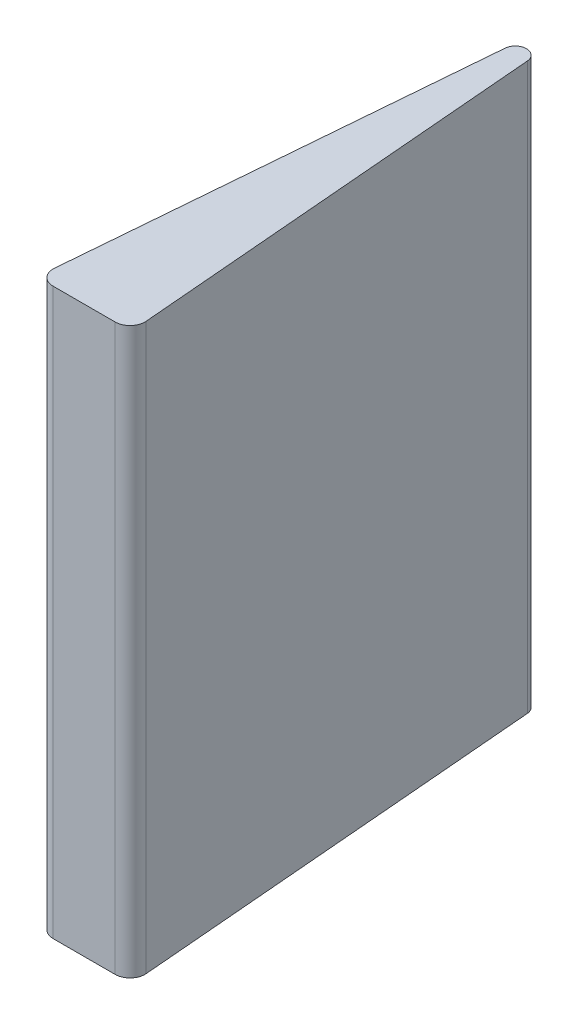
ISO-10303-21;
HEADER;
FILE_DESCRIPTION(('STEP AP214'),'2;1');
FILE_NAME('part.step','',(''),(''),'','','');
FILE_SCHEMA(('AUTOMOTIVE_DESIGN { 1 0 10303 214 1 1 1 1 }'));
ENDSEC;
DATA;
#1=APPLICATION_CONTEXT('core data for automotive mechanical design processes');
#2=APPLICATION_PROTOCOL_DEFINITION('international standard','automotive_design',2000,#1);
#3=PRODUCT_CONTEXT('',#1,'mechanical');
#4=PRODUCT('Part','Part','',(#3));
#5=PRODUCT_RELATED_PRODUCT_CATEGORY('part','',(#4));
#6=PRODUCT_DEFINITION_FORMATION('','',#4);
#7=PRODUCT_DEFINITION_CONTEXT('part definition',#1,'design');
#8=PRODUCT_DEFINITION('design','',#6,#7);
#9=PRODUCT_DEFINITION_SHAPE('','',#8);
#10=(LENGTH_UNIT() NAMED_UNIT(*) SI_UNIT(.MILLI.,.METRE.));
#11=(NAMED_UNIT(*) PLANE_ANGLE_UNIT() SI_UNIT($,.RADIAN.));
#12=(NAMED_UNIT(*) SI_UNIT($,.STERADIAN.) SOLID_ANGLE_UNIT());
#13=UNCERTAINTY_MEASURE_WITH_UNIT(LENGTH_MEASURE(1.E-05),#10,'distance_accuracy_value','');
#14=(GEOMETRIC_REPRESENTATION_CONTEXT(3) GLOBAL_UNCERTAINTY_ASSIGNED_CONTEXT((#13)) GLOBAL_UNIT_ASSIGNED_CONTEXT((#10,
#11,#12)) REPRESENTATION_CONTEXT('',''));
#15=CARTESIAN_POINT('',(0.,0.,0.));
#16=DIRECTION('',(0.,0.,1.));
#17=DIRECTION('',(1.,0.,0.));
#18=AXIS2_PLACEMENT_3D('',#15,#16,#17);
#19=CARTESIAN_POINT('',(0.,-380.,-460.));
#20=DIRECTION('',(0.,1.,0.));
#21=DIRECTION('',(0.,0.,1.));
#22=AXIS2_PLACEMENT_3D('',#19,#20,#21);
#23=CYLINDRICAL_SURFACE('',#22,15.);
#24=DIRECTION('',(0.,1.,0.));
#25=VECTOR('',#24,1.);
#26=CARTESIAN_POINT('',(-14.9478930237818,-380.,-461.249197402165));
#27=LINE('',#26,#25);
#28=CARTESIAN_POINT('',(-14.9478930237818,-380.,-461.249197402165));
#29=VERTEX_POINT('',#28);
#30=CARTESIAN_POINT('',(-14.9478930237818,380.,-461.249197402165));
#31=VERTEX_POINT('',#30);
#32=EDGE_CURVE('E47',#29,#31,#27,.T.);
#33=ORIENTED_EDGE('',*,*,#32,.T.);
#34=CARTESIAN_POINT('',(0.,380.,-460.));
#35=DIRECTION('',(0.,1.,0.));
#36=DIRECTION('',(0.,0.,-1.));
#37=AXIS2_PLACEMENT_3D('',#34,#35,#36);
#38=CIRCLE('',#37,15.);
#39=CARTESIAN_POINT('',(14.9478930237818,380.,-461.249197402165));
#40=VERTEX_POINT('',#39);
#41=EDGE_CURVE('E96',#40,#31,#38,.T.);
#42=ORIENTED_EDGE('',*,*,#41,.F.);
#43=DIRECTION('',(0.,1.,0.));
#44=VECTOR('',#43,1.);
#45=CARTESIAN_POINT('',(14.9478930237818,-380.,-461.249197402165));
#46=LINE('',#45,#44);
#47=CARTESIAN_POINT('',(14.9478930237818,-380.,-461.249197402165));
#48=VERTEX_POINT('',#47);
#49=EDGE_CURVE('E13',#48,#40,#46,.T.);
#50=ORIENTED_EDGE('',*,*,#49,.F.);
#51=CARTESIAN_POINT('',(0.,-380.,-460.));
#52=DIRECTION('',(0.,1.,0.));
#53=DIRECTION('',(0.,0.,-1.));
#54=AXIS2_PLACEMENT_3D('',#51,#52,#53);
#55=CIRCLE('',#54,15.);
#56=EDGE_CURVE('E97',#48,#29,#55,.T.);
#57=ORIENTED_EDGE('',*,*,#56,.T.);
#58=EDGE_LOOP('',(#33,#42,#50,#57));
#59=FACE_BOUND('',#58,.T.);
#60=ADVANCED_FACE('F44',(#59),#23,.T.);
#61=CARTESIAN_POINT('',(61.7123687517953,-380.,98.3344034637807));
#62=DIRECTION('',(0.996526201585455,0.,-0.0832798268109657));
#63=DIRECTION('',(-0.0832798268109657,0.,-0.996526201585455));
#64=AXIS2_PLACEMENT_3D('',#61,#62,#63);
#65=PLANE('',#64);
#66=ORIENTED_EDGE('',*,*,#49,.T.);
#67=DIRECTION('',(-0.0832798268109657,0.,-0.996526201585455));
#68=VECTOR('',#67,1.);
#69=CARTESIAN_POINT('',(61.7123687517953,380.,98.3344034637807));
#70=LINE('',#69,#68);
#71=CARTESIAN_POINT('',(61.7123687517953,380.,98.3344034637807));
#72=VERTEX_POINT('',#71);
#73=EDGE_CURVE('E114',#72,#40,#70,.T.);
#74=ORIENTED_EDGE('',*,*,#73,.F.);
#75=DIRECTION('',(0.,1.,0.));
#76=VECTOR('',#75,1.);
#77=CARTESIAN_POINT('',(61.7123687517953,-380.,98.3344034637807));
#78=LINE('',#77,#76);
#79=CARTESIAN_POINT('',(61.7123687517953,-380.,98.3344034637807));
#80=VERTEX_POINT('',#79);
#81=EDGE_CURVE('E52',#80,#72,#78,.T.);
#82=ORIENTED_EDGE('',*,*,#81,.F.);
#83=DIRECTION('',(-0.0832798268109657,0.,-0.996526201585455));
#84=VECTOR('',#83,1.);
#85=CARTESIAN_POINT('',(61.7123687517953,-380.,98.3344034637807));
#86=LINE('',#85,#84);
#87=EDGE_CURVE('E102',#80,#48,#86,.T.);
#88=ORIENTED_EDGE('',*,*,#87,.T.);
#89=EDGE_LOOP('',(#66,#74,#82,#88));
#90=FACE_BOUND('',#89,.T.);
#91=ADVANCED_FACE('F154',(#90),#65,.T.);
#92=CARTESIAN_POINT('',(41.7818447200862,-380.,100.));
#93=DIRECTION('',(0.,1.,0.));
#94=DIRECTION('',(0.,0.,1.));
#95=AXIS2_PLACEMENT_3D('',#92,#93,#94);
#96=CYLINDRICAL_SURFACE('',#95,20.);
#97=ORIENTED_EDGE('',*,*,#81,.T.);
#98=CARTESIAN_POINT('',(41.7818447200862,380.,100.));
#99=DIRECTION('',(0.,1.,0.));
#100=DIRECTION('',(0.,0.,-1.));
#101=AXIS2_PLACEMENT_3D('',#98,#99,#100);
#102=CIRCLE('',#101,20.);
#103=CARTESIAN_POINT('',(41.7818447200862,380.,120.));
#104=VERTEX_POINT('',#103);
#105=EDGE_CURVE('E121',#104,#72,#102,.T.);
#106=ORIENTED_EDGE('',*,*,#105,.F.);
#107=DIRECTION('',(0.,1.,0.));
#108=VECTOR('',#107,1.);
#109=CARTESIAN_POINT('',(41.7818447200862,-380.,120.));
#110=LINE('',#109,#108);
#111=CARTESIAN_POINT('',(41.7818447200862,-380.,120.));
#112=VERTEX_POINT('',#111);
#113=EDGE_CURVE('E137',#112,#104,#110,.T.);
#114=ORIENTED_EDGE('',*,*,#113,.F.);
#115=CARTESIAN_POINT('',(41.7818447200862,-380.,100.));
#116=DIRECTION('',(0.,1.,0.));
#117=DIRECTION('',(0.,0.,-1.));
#118=AXIS2_PLACEMENT_3D('',#115,#116,#117);
#119=CIRCLE('',#118,20.);
#120=EDGE_CURVE('E133',#112,#80,#119,.T.);
#121=ORIENTED_EDGE('',*,*,#120,.T.);
#122=EDGE_LOOP('',(#97,#106,#114,#121));
#123=FACE_BOUND('',#122,.T.);
#124=ADVANCED_FACE('F150',(#123),#96,.T.);
#125=CARTESIAN_POINT('',(-41.7818447200862,-380.,120.));
#126=DIRECTION('',(0.,0.,1.));
#127=DIRECTION('',(1.,0.,0.));
#128=AXIS2_PLACEMENT_3D('',#125,#126,#127);
#129=PLANE('',#128);
#130=ORIENTED_EDGE('',*,*,#113,.T.);
#131=DIRECTION('',(1.,0.,0.));
#132=VECTOR('',#131,1.);
#133=CARTESIAN_POINT('',(-41.7818447200862,380.,120.));
#134=LINE('',#133,#132);
#135=CARTESIAN_POINT('',(-41.7818447200862,380.,120.));
#136=VERTEX_POINT('',#135);
#137=EDGE_CURVE('E118',#136,#104,#134,.T.);
#138=ORIENTED_EDGE('',*,*,#137,.F.);
#139=DIRECTION('',(0.,1.,0.));
#140=VECTOR('',#139,1.);
#141=CARTESIAN_POINT('',(-41.7818447200862,-380.,120.));
#142=LINE('',#141,#140);
#143=CARTESIAN_POINT('',(-41.7818447200862,-380.,120.));
#144=VERTEX_POINT('',#143);
#145=EDGE_CURVE('E139',#144,#136,#142,.T.);
#146=ORIENTED_EDGE('',*,*,#145,.F.);
#147=DIRECTION('',(1.,0.,0.));
#148=VECTOR('',#147,1.);
#149=CARTESIAN_POINT('',(-41.7818447200862,-380.,120.));
#150=LINE('',#149,#148);
#151=EDGE_CURVE('E130',#144,#112,#150,.T.);
#152=ORIENTED_EDGE('',*,*,#151,.T.);
#153=EDGE_LOOP('',(#130,#138,#146,#152));
#154=FACE_BOUND('',#153,.T.);
#155=ADVANCED_FACE('F147',(#154),#129,.T.);
#156=CARTESIAN_POINT('',(-41.7818447200862,-380.,100.));
#157=DIRECTION('',(0.,1.,0.));
#158=DIRECTION('',(0.,0.,1.));
#159=AXIS2_PLACEMENT_3D('',#156,#157,#158);
#160=CYLINDRICAL_SURFACE('',#159,20.);
#161=ORIENTED_EDGE('',*,*,#145,.T.);
#162=CARTESIAN_POINT('',(-41.7818447200862,380.,100.));
#163=DIRECTION('',(0.,1.,0.));
#164=DIRECTION('',(0.,0.,1.));
#165=AXIS2_PLACEMENT_3D('',#162,#163,#164);
#166=CIRCLE('',#165,20.);
#167=CARTESIAN_POINT('',(-61.7123687517953,380.,98.3344034637807));
#168=VERTEX_POINT('',#167);
#169=EDGE_CURVE('E109',#168,#136,#166,.T.);
#170=ORIENTED_EDGE('',*,*,#169,.F.);
#171=DIRECTION('',(0.,1.,0.));
#172=VECTOR('',#171,1.);
#173=CARTESIAN_POINT('',(-61.7123687517953,-380.,98.3344034637807));
#174=LINE('',#173,#172);
#175=CARTESIAN_POINT('',(-61.7123687517953,-380.,98.3344034637807));
#176=VERTEX_POINT('',#175);
#177=EDGE_CURVE('E101',#176,#168,#174,.T.);
#178=ORIENTED_EDGE('',*,*,#177,.F.);
#179=CARTESIAN_POINT('',(-41.7818447200862,-380.,100.));
#180=DIRECTION('',(0.,1.,0.));
#181=DIRECTION('',(0.,0.,1.));
#182=AXIS2_PLACEMENT_3D('',#179,#180,#181);
#183=CIRCLE('',#182,20.);
#184=EDGE_CURVE('E127',#176,#144,#183,.T.);
#185=ORIENTED_EDGE('',*,*,#184,.T.);
#186=EDGE_LOOP('',(#161,#170,#178,#185));
#187=FACE_BOUND('',#186,.T.);
#188=ADVANCED_FACE('F141',(#187),#160,.T.);
#189=CARTESIAN_POINT('',(-61.7123687517953,-380.,98.3344034637807));
#190=DIRECTION('',(-0.996526201585455,0.,-0.0832798268109657));
#191=DIRECTION('',(-0.0832798268109657,0.,0.996526201585455));
#192=AXIS2_PLACEMENT_3D('',#189,#190,#191);
#193=PLANE('',#192);
#194=ORIENTED_EDGE('',*,*,#177,.T.);
#195=DIRECTION('',(-0.0832798268109657,0.,0.996526201585455));
#196=VECTOR('',#195,1.);
#197=CARTESIAN_POINT('',(-61.7123687517953,380.,98.3344034637807));
#198=LINE('',#197,#196);
#199=EDGE_CURVE('E104',#31,#168,#198,.T.);
#200=ORIENTED_EDGE('',*,*,#199,.F.);
#201=ORIENTED_EDGE('',*,*,#32,.F.);
#202=DIRECTION('',(-0.0832798268109657,0.,0.996526201585455));
#203=VECTOR('',#202,1.);
#204=CARTESIAN_POINT('',(-61.7123687517953,-380.,98.3344034637807));
#205=LINE('',#204,#203);
#206=EDGE_CURVE('E125',#29,#176,#205,.T.);
#207=ORIENTED_EDGE('',*,*,#206,.T.);
#208=EDGE_LOOP('',(#194,#200,#201,#207));
#209=FACE_BOUND('',#208,.T.);
#210=ADVANCED_FACE('F105',(#209),#193,.T.);
#211=CARTESIAN_POINT('',(0.,-380.,-460.));
#212=DIRECTION('',(0.,-1.,0.));
#213=DIRECTION('',(0.,0.,-1.));
#214=AXIS2_PLACEMENT_3D('',#211,#212,#213);
#215=PLANE('',#214);
#216=ORIENTED_EDGE('',*,*,#56,.F.);
#217=ORIENTED_EDGE('',*,*,#87,.F.);
#218=ORIENTED_EDGE('',*,*,#120,.F.);
#219=ORIENTED_EDGE('',*,*,#151,.F.);
#220=ORIENTED_EDGE('',*,*,#184,.F.);
#221=ORIENTED_EDGE('',*,*,#206,.F.);
#222=EDGE_LOOP('',(#216,#217,#218,#219,#220,#221));
#223=FACE_BOUND('',#222,.T.);
#224=ADVANCED_FACE('F153',(#223),#215,.T.);
#225=CARTESIAN_POINT('',(0.,380.,-460.));
#226=DIRECTION('',(0.,-1.,0.));
#227=DIRECTION('',(0.,0.,-1.));
#228=AXIS2_PLACEMENT_3D('',#225,#226,#227);
#229=PLANE('',#228);
#230=ORIENTED_EDGE('',*,*,#41,.T.);
#231=ORIENTED_EDGE('',*,*,#199,.T.);
#232=ORIENTED_EDGE('',*,*,#169,.T.);
#233=ORIENTED_EDGE('',*,*,#137,.T.);
#234=ORIENTED_EDGE('',*,*,#105,.T.);
#235=ORIENTED_EDGE('',*,*,#73,.T.);
#236=EDGE_LOOP('',(#230,#231,#232,#233,#234,#235));
#237=FACE_BOUND('',#236,.T.);
#238=ADVANCED_FACE('F112',(#237),#229,.F.);
#239=CLOSED_SHELL('',(#60,#91,#124,#155,#188,#210,#224,#238));
#240=MANIFOLD_SOLID_BREP('B2',#239);
#241=ADVANCED_BREP_SHAPE_REPRESENTATION('',(#18,#240),#14);
#242=SHAPE_DEFINITION_REPRESENTATION(#9,#241);
ENDSEC;
END-ISO-10303-21;
